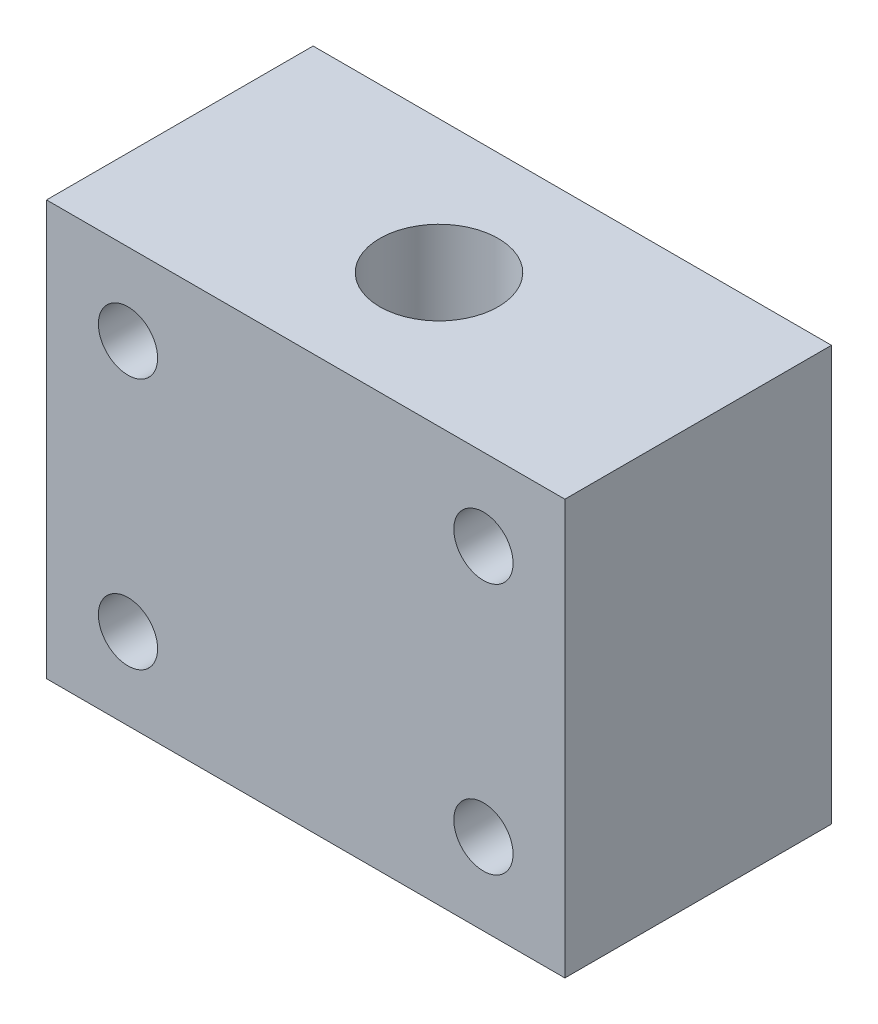
ISO-10303-21;
HEADER;
FILE_DESCRIPTION(('STEP AP214'),'2;1');
FILE_NAME('part.step','',(''),(''),'','','');
FILE_SCHEMA(('AUTOMOTIVE_DESIGN { 1 0 10303 214 1 1 1 1 }'));
ENDSEC;
DATA;
#1=APPLICATION_CONTEXT('core data for automotive mechanical design processes');
#2=APPLICATION_PROTOCOL_DEFINITION('international standard','automotive_design',2000,#1);
#3=PRODUCT_CONTEXT('',#1,'mechanical');
#4=PRODUCT('Part','Part','',(#3));
#5=PRODUCT_RELATED_PRODUCT_CATEGORY('part','',(#4));
#6=PRODUCT_DEFINITION_FORMATION('','',#4);
#7=PRODUCT_DEFINITION_CONTEXT('part definition',#1,'design');
#8=PRODUCT_DEFINITION('design','',#6,#7);
#9=PRODUCT_DEFINITION_SHAPE('','',#8);
#10=(LENGTH_UNIT() NAMED_UNIT(*) SI_UNIT(.MILLI.,.METRE.));
#11=(NAMED_UNIT(*) PLANE_ANGLE_UNIT() SI_UNIT($,.RADIAN.));
#12=(NAMED_UNIT(*) SI_UNIT($,.STERADIAN.) SOLID_ANGLE_UNIT());
#13=UNCERTAINTY_MEASURE_WITH_UNIT(LENGTH_MEASURE(1.E-05),#10,'distance_accuracy_value','');
#14=(GEOMETRIC_REPRESENTATION_CONTEXT(3) GLOBAL_UNCERTAINTY_ASSIGNED_CONTEXT((#13)) GLOBAL_UNIT_ASSIGNED_CONTEXT((#10,
#11,#12)) REPRESENTATION_CONTEXT('',''));
#15=CARTESIAN_POINT('',(0.,0.,0.));
#16=DIRECTION('',(0.,0.,1.));
#17=DIRECTION('',(1.,0.,0.));
#18=AXIS2_PLACEMENT_3D('',#15,#16,#17);
#19=CARTESIAN_POINT('',(0.,0.,18.));
#20=DIRECTION('',(0.,0.,-1.));
#21=DIRECTION('',(-1.,0.,0.));
#22=AXIS2_PLACEMENT_3D('',#19,#20,#21);
#23=PLANE('',#22);
#24=DIRECTION('',(0.,-1.,0.));
#25=VECTOR('',#24,1.);
#26=CARTESIAN_POINT('',(-31.0409039529371,-8.22103591548125,18.));
#27=LINE('',#26,#25);
#28=CARTESIAN_POINT('',(-31.0409039529371,19.7789640845187,18.));
#29=VERTEX_POINT('',#28);
#30=CARTESIAN_POINT('',(-31.0409039529371,-8.22103591548125,18.));
#31=VERTEX_POINT('',#30);
#32=EDGE_CURVE('E84',#29,#31,#27,.T.);
#33=ORIENTED_EDGE('',*,*,#32,.T.);
#34=DIRECTION('',(1.,0.,0.));
#35=VECTOR('',#34,1.);
#36=CARTESIAN_POINT('',(-31.0409039529371,-8.22103591548125,18.));
#37=LINE('',#36,#35);
#38=CARTESIAN_POINT('',(3.95909604706289,-8.22103591548125,18.));
#39=VERTEX_POINT('',#38);
#40=EDGE_CURVE('E79',#31,#39,#37,.T.);
#41=ORIENTED_EDGE('',*,*,#40,.T.);
#42=DIRECTION('',(0.,1.,0.));
#43=VECTOR('',#42,1.);
#44=CARTESIAN_POINT('',(3.95909604706289,-8.22103591548125,18.));
#45=LINE('',#44,#43);
#46=CARTESIAN_POINT('',(3.95909604706289,19.7789640845187,18.));
#47=VERTEX_POINT('',#46);
#48=EDGE_CURVE('E82',#39,#47,#45,.T.);
#49=ORIENTED_EDGE('',*,*,#48,.T.);
#50=DIRECTION('',(-1.,0.,0.));
#51=VECTOR('',#50,1.);
#52=CARTESIAN_POINT('',(-31.0409039529371,19.7789640845187,18.));
#53=LINE('',#52,#51);
#54=EDGE_CURVE('E49',#47,#29,#53,.T.);
#55=ORIENTED_EDGE('',*,*,#54,.T.);
#56=EDGE_LOOP('',(#33,#41,#49,#55));
#57=FACE_BOUND('',#56,.T.);
#58=CARTESIAN_POINT('',(-25.5409039529371,14.2789640845187,18.));
#59=DIRECTION('',(0.,0.,1.));
#60=DIRECTION('',(1.,0.,0.));
#61=AXIS2_PLACEMENT_3D('',#58,#59,#60);
#62=CIRCLE('',#61,2.);
#63=CARTESIAN_POINT('',(-23.5409039529371,14.2789640845187,18.));
#64=VERTEX_POINT('',#63);
#65=EDGE_CURVE('E99',#64,#64,#62,.T.);
#66=ORIENTED_EDGE('',*,*,#65,.F.);
#67=EDGE_LOOP('',(#66));
#68=FACE_BOUND('',#67,.T.);
#69=CARTESIAN_POINT('',(-1.54090395293711,14.2789640845187,18.));
#70=DIRECTION('',(0.,0.,1.));
#71=DIRECTION('',(1.,0.,0.));
#72=AXIS2_PLACEMENT_3D('',#69,#70,#71);
#73=CIRCLE('',#72,2.);
#74=CARTESIAN_POINT('',(0.459096047062897,14.2789640845187,18.));
#75=VERTEX_POINT('',#74);
#76=EDGE_CURVE('E114',#75,#75,#73,.T.);
#77=ORIENTED_EDGE('',*,*,#76,.F.);
#78=EDGE_LOOP('',(#77));
#79=FACE_BOUND('',#78,.T.);
#80=CARTESIAN_POINT('',(-25.5409039529371,-2.72103591548126,18.));
#81=DIRECTION('',(0.,0.,1.));
#82=DIRECTION('',(1.,0.,0.));
#83=AXIS2_PLACEMENT_3D('',#80,#81,#82);
#84=CIRCLE('',#83,2.);
#85=CARTESIAN_POINT('',(-23.5409039529371,-2.72103591548126,18.));
#86=VERTEX_POINT('',#85);
#87=EDGE_CURVE('E120',#86,#86,#84,.T.);
#88=ORIENTED_EDGE('',*,*,#87,.F.);
#89=EDGE_LOOP('',(#88));
#90=FACE_BOUND('',#89,.T.);
#91=CARTESIAN_POINT('',(-1.54090395293711,-2.72103591548126,18.));
#92=DIRECTION('',(0.,0.,1.));
#93=DIRECTION('',(1.,0.,0.));
#94=AXIS2_PLACEMENT_3D('',#91,#92,#93);
#95=CIRCLE('',#94,2.);
#96=CARTESIAN_POINT('',(0.459096047062896,-2.72103591548126,18.));
#97=VERTEX_POINT('',#96);
#98=EDGE_CURVE('E126',#97,#97,#95,.T.);
#99=ORIENTED_EDGE('',*,*,#98,.F.);
#100=EDGE_LOOP('',(#99));
#101=FACE_BOUND('',#100,.T.);
#102=ADVANCED_FACE('F32',(#57,#68,#79,#90,#101),#23,.F.);
#103=CARTESIAN_POINT('',(0.,0.,0.));
#104=DIRECTION('',(0.,0.,-1.));
#105=DIRECTION('',(-1.,0.,0.));
#106=AXIS2_PLACEMENT_3D('',#103,#104,#105);
#107=PLANE('',#106);
#108=CARTESIAN_POINT('',(-25.5409039529371,-2.72103591548126,0.));
#109=DIRECTION('',(0.,0.,1.));
#110=DIRECTION('',(1.,0.,0.));
#111=AXIS2_PLACEMENT_3D('',#108,#109,#110);
#112=CIRCLE('',#111,2.);
#113=CARTESIAN_POINT('',(-23.5409039529371,-2.72103591548126,0.));
#114=VERTEX_POINT('',#113);
#115=EDGE_CURVE('E123',#114,#114,#112,.T.);
#116=ORIENTED_EDGE('',*,*,#115,.T.);
#117=EDGE_LOOP('',(#116));
#118=FACE_BOUND('',#117,.T.);
#119=CARTESIAN_POINT('',(-25.5409039529371,14.2789640845187,0.));
#120=DIRECTION('',(0.,0.,1.));
#121=DIRECTION('',(1.,0.,0.));
#122=AXIS2_PLACEMENT_3D('',#119,#120,#121);
#123=CIRCLE('',#122,2.);
#124=CARTESIAN_POINT('',(-23.5409039529371,14.2789640845187,0.));
#125=VERTEX_POINT('',#124);
#126=EDGE_CURVE('E111',#125,#125,#123,.T.);
#127=ORIENTED_EDGE('',*,*,#126,.T.);
#128=EDGE_LOOP('',(#127));
#129=FACE_BOUND('',#128,.T.);
#130=DIRECTION('',(0.,-1.,0.));
#131=VECTOR('',#130,1.);
#132=CARTESIAN_POINT('',(-31.0409039529371,-8.22103591548125,0.));
#133=LINE('',#132,#131);
#134=CARTESIAN_POINT('',(-31.0409039529371,19.7789640845187,0.));
#135=VERTEX_POINT('',#134);
#136=CARTESIAN_POINT('',(-31.0409039529371,-8.22103591548125,0.));
#137=VERTEX_POINT('',#136);
#138=EDGE_CURVE('E96',#135,#137,#133,.T.);
#139=ORIENTED_EDGE('',*,*,#138,.F.);
#140=DIRECTION('',(-1.,0.,0.));
#141=VECTOR('',#140,1.);
#142=CARTESIAN_POINT('',(-31.0409039529371,19.7789640845187,0.));
#143=LINE('',#142,#141);
#144=CARTESIAN_POINT('',(3.95909604706289,19.7789640845187,0.));
#145=VERTEX_POINT('',#144);
#146=EDGE_CURVE('E72',#145,#135,#143,.T.);
#147=ORIENTED_EDGE('',*,*,#146,.F.);
#148=DIRECTION('',(0.,1.,0.));
#149=VECTOR('',#148,1.);
#150=CARTESIAN_POINT('',(3.95909604706289,-8.22103591548125,0.));
#151=LINE('',#150,#149);
#152=CARTESIAN_POINT('',(3.95909604706289,-8.22103591548125,0.));
#153=VERTEX_POINT('',#152);
#154=EDGE_CURVE('E66',#153,#145,#151,.T.);
#155=ORIENTED_EDGE('',*,*,#154,.F.);
#156=DIRECTION('',(1.,0.,0.));
#157=VECTOR('',#156,1.);
#158=CARTESIAN_POINT('',(-31.0409039529371,-8.22103591548125,0.));
#159=LINE('',#158,#157);
#160=EDGE_CURVE('E88',#137,#153,#159,.T.);
#161=ORIENTED_EDGE('',*,*,#160,.F.);
#162=EDGE_LOOP('',(#139,#147,#155,#161));
#163=FACE_BOUND('',#162,.T.);
#164=CARTESIAN_POINT('',(-1.54090395293711,14.2789640845187,0.));
#165=DIRECTION('',(0.,0.,1.));
#166=DIRECTION('',(1.,0.,0.));
#167=AXIS2_PLACEMENT_3D('',#164,#165,#166);
#168=CIRCLE('',#167,2.);
#169=CARTESIAN_POINT('',(0.459096047062897,14.2789640845187,0.));
#170=VERTEX_POINT('',#169);
#171=EDGE_CURVE('E117',#170,#170,#168,.T.);
#172=ORIENTED_EDGE('',*,*,#171,.T.);
#173=EDGE_LOOP('',(#172));
#174=FACE_BOUND('',#173,.T.);
#175=CARTESIAN_POINT('',(-1.54090395293711,-2.72103591548126,0.));
#176=DIRECTION('',(0.,0.,1.));
#177=DIRECTION('',(1.,0.,0.));
#178=AXIS2_PLACEMENT_3D('',#175,#176,#177);
#179=CIRCLE('',#178,2.);
#180=CARTESIAN_POINT('',(0.459096047062896,-2.72103591548126,0.));
#181=VERTEX_POINT('',#180);
#182=EDGE_CURVE('E129',#181,#181,#179,.T.);
#183=ORIENTED_EDGE('',*,*,#182,.T.);
#184=EDGE_LOOP('',(#183));
#185=FACE_BOUND('',#184,.T.);
#186=ADVANCED_FACE('F107',(#118,#129,#163,#174,#185),#107,.T.);
#187=CARTESIAN_POINT('',(-31.0409039529371,-8.22103591548125,18.));
#188=DIRECTION('',(1.,0.,0.));
#189=DIRECTION('',(0.,0.,-1.));
#190=AXIS2_PLACEMENT_3D('',#187,#188,#189);
#191=PLANE('',#190);
#192=ORIENTED_EDGE('',*,*,#138,.T.);
#193=DIRECTION('',(0.,0.,-1.));
#194=VECTOR('',#193,1.);
#195=CARTESIAN_POINT('',(-31.0409039529371,-8.22103591548125,18.));
#196=LINE('',#195,#194);
#197=EDGE_CURVE('E11',#31,#137,#196,.T.);
#198=ORIENTED_EDGE('',*,*,#197,.F.);
#199=ORIENTED_EDGE('',*,*,#32,.F.);
#200=DIRECTION('',(0.,0.,-1.));
#201=VECTOR('',#200,1.);
#202=CARTESIAN_POINT('',(-31.0409039529371,19.7789640845187,18.));
#203=LINE('',#202,#201);
#204=EDGE_CURVE('E92',#29,#135,#203,.T.);
#205=ORIENTED_EDGE('',*,*,#204,.T.);
#206=EDGE_LOOP('',(#192,#198,#199,#205));
#207=FACE_BOUND('',#206,.T.);
#208=ADVANCED_FACE('F34',(#207),#191,.F.);
#209=CARTESIAN_POINT('',(-31.0409039529371,-8.22103591548125,18.));
#210=DIRECTION('',(0.,1.,0.));
#211=DIRECTION('',(0.,0.,1.));
#212=AXIS2_PLACEMENT_3D('',#209,#210,#211);
#213=PLANE('',#212);
#214=CARTESIAN_POINT('',(-13.5409039529371,-8.22103591548125,9.));
#215=DIRECTION('',(0.,1.,0.));
#216=DIRECTION('',(0.,0.,1.));
#217=AXIS2_PLACEMENT_3D('',#214,#215,#216);
#218=CIRCLE('',#217,4.);
#219=CARTESIAN_POINT('',(-13.5409039529371,-8.22103591548125,13.));
#220=VERTEX_POINT('',#219);
#221=EDGE_CURVE('E135',#220,#220,#218,.T.);
#222=ORIENTED_EDGE('',*,*,#221,.T.);
#223=EDGE_LOOP('',(#222));
#224=FACE_BOUND('',#223,.T.);
#225=ORIENTED_EDGE('',*,*,#160,.T.);
#226=DIRECTION('',(0.,0.,-1.));
#227=VECTOR('',#226,1.);
#228=CARTESIAN_POINT('',(3.95909604706289,-8.22103591548125,18.));
#229=LINE('',#228,#227);
#230=EDGE_CURVE('E41',#39,#153,#229,.T.);
#231=ORIENTED_EDGE('',*,*,#230,.F.);
#232=ORIENTED_EDGE('',*,*,#40,.F.);
#233=ORIENTED_EDGE('',*,*,#197,.T.);
#234=EDGE_LOOP('',(#225,#231,#232,#233));
#235=FACE_BOUND('',#234,.T.);
#236=ADVANCED_FACE('F87',(#224,#235),#213,.F.);
#237=CARTESIAN_POINT('',(3.95909604706289,-8.22103591548125,18.));
#238=DIRECTION('',(-1.,0.,0.));
#239=DIRECTION('',(0.,0.,1.));
#240=AXIS2_PLACEMENT_3D('',#237,#238,#239);
#241=PLANE('',#240);
#242=ORIENTED_EDGE('',*,*,#154,.T.);
#243=DIRECTION('',(0.,0.,-1.));
#244=VECTOR('',#243,1.);
#245=CARTESIAN_POINT('',(3.95909604706289,19.7789640845187,18.));
#246=LINE('',#245,#244);
#247=EDGE_CURVE('E89',#47,#145,#246,.T.);
#248=ORIENTED_EDGE('',*,*,#247,.F.);
#249=ORIENTED_EDGE('',*,*,#48,.F.);
#250=ORIENTED_EDGE('',*,*,#230,.T.);
#251=EDGE_LOOP('',(#242,#248,#249,#250));
#252=FACE_BOUND('',#251,.T.);
#253=ADVANCED_FACE('F90',(#252),#241,.F.);
#254=CARTESIAN_POINT('',(-31.0409039529371,19.7789640845187,18.));
#255=DIRECTION('',(0.,-1.,0.));
#256=DIRECTION('',(0.,0.,-1.));
#257=AXIS2_PLACEMENT_3D('',#254,#255,#256);
#258=PLANE('',#257);
#259=CARTESIAN_POINT('',(-13.5409039529371,19.7789640845187,9.));
#260=DIRECTION('',(0.,1.,0.));
#261=DIRECTION('',(0.,0.,1.));
#262=AXIS2_PLACEMENT_3D('',#259,#260,#261);
#263=CIRCLE('',#262,4.);
#264=CARTESIAN_POINT('',(-13.5409039529371,19.7789640845187,13.));
#265=VERTEX_POINT('',#264);
#266=EDGE_CURVE('E132',#265,#265,#263,.T.);
#267=ORIENTED_EDGE('',*,*,#266,.F.);
#268=EDGE_LOOP('',(#267));
#269=FACE_BOUND('',#268,.T.);
#270=ORIENTED_EDGE('',*,*,#146,.T.);
#271=ORIENTED_EDGE('',*,*,#204,.F.);
#272=ORIENTED_EDGE('',*,*,#54,.F.);
#273=ORIENTED_EDGE('',*,*,#247,.T.);
#274=EDGE_LOOP('',(#270,#271,#272,#273));
#275=FACE_BOUND('',#274,.T.);
#276=ADVANCED_FACE('F104',(#269,#275),#258,.F.);
#277=CARTESIAN_POINT('',(-25.5409039529371,14.2789640845187,18.));
#278=DIRECTION('',(0.,0.,-1.));
#279=DIRECTION('',(-1.,0.,0.));
#280=AXIS2_PLACEMENT_3D('',#277,#278,#279);
#281=CYLINDRICAL_SURFACE('',#280,2.);
#282=ORIENTED_EDGE('',*,*,#65,.T.);
#283=EDGE_LOOP('',(#282));
#284=FACE_BOUND('',#283,.T.);
#285=ORIENTED_EDGE('',*,*,#126,.F.);
#286=EDGE_LOOP('',(#285));
#287=FACE_BOUND('',#286,.T.);
#288=ADVANCED_FACE('F145',(#284,#287),#281,.F.);
#289=CARTESIAN_POINT('',(-1.54090395293711,14.2789640845187,18.));
#290=DIRECTION('',(0.,0.,-1.));
#291=DIRECTION('',(-1.,0.,0.));
#292=AXIS2_PLACEMENT_3D('',#289,#290,#291);
#293=CYLINDRICAL_SURFACE('',#292,2.);
#294=ORIENTED_EDGE('',*,*,#76,.T.);
#295=EDGE_LOOP('',(#294));
#296=FACE_BOUND('',#295,.T.);
#297=ORIENTED_EDGE('',*,*,#171,.F.);
#298=EDGE_LOOP('',(#297));
#299=FACE_BOUND('',#298,.T.);
#300=ADVANCED_FACE('F151',(#296,#299),#293,.F.);
#301=CARTESIAN_POINT('',(-25.5409039529371,-2.72103591548126,18.));
#302=DIRECTION('',(0.,0.,-1.));
#303=DIRECTION('',(-1.,0.,0.));
#304=AXIS2_PLACEMENT_3D('',#301,#302,#303);
#305=CYLINDRICAL_SURFACE('',#304,2.);
#306=ORIENTED_EDGE('',*,*,#87,.T.);
#307=EDGE_LOOP('',(#306));
#308=FACE_BOUND('',#307,.T.);
#309=ORIENTED_EDGE('',*,*,#115,.F.);
#310=EDGE_LOOP('',(#309));
#311=FACE_BOUND('',#310,.T.);
#312=ADVANCED_FACE('F165',(#308,#311),#305,.F.);
#313=CARTESIAN_POINT('',(-1.54090395293711,-2.72103591548126,18.));
#314=DIRECTION('',(0.,0.,-1.));
#315=DIRECTION('',(-1.,0.,0.));
#316=AXIS2_PLACEMENT_3D('',#313,#314,#315);
#317=CYLINDRICAL_SURFACE('',#316,2.);
#318=ORIENTED_EDGE('',*,*,#98,.T.);
#319=EDGE_LOOP('',(#318));
#320=FACE_BOUND('',#319,.T.);
#321=ORIENTED_EDGE('',*,*,#182,.F.);
#322=EDGE_LOOP('',(#321));
#323=FACE_BOUND('',#322,.T.);
#324=ADVANCED_FACE('F169',(#320,#323),#317,.F.);
#325=CARTESIAN_POINT('',(-13.5409039529371,19.7789640845187,9.));
#326=DIRECTION('',(0.,-1.,0.));
#327=DIRECTION('',(0.,0.,-1.));
#328=AXIS2_PLACEMENT_3D('',#325,#326,#327);
#329=CYLINDRICAL_SURFACE('',#328,4.);
#330=ORIENTED_EDGE('',*,*,#266,.T.);
#331=EDGE_LOOP('',(#330));
#332=FACE_BOUND('',#331,.T.);
#333=ORIENTED_EDGE('',*,*,#221,.F.);
#334=EDGE_LOOP('',(#333));
#335=FACE_BOUND('',#334,.T.);
#336=ADVANCED_FACE('F141',(#332,#335),#329,.F.);
#337=CLOSED_SHELL('',(#102,#186,#208,#236,#253,#276,#288,#300,#312,#324,#336));
#338=MANIFOLD_SOLID_BREP('B2',#337);
#339=ADVANCED_BREP_SHAPE_REPRESENTATION('',(#18,#338),#14);
#340=SHAPE_DEFINITION_REPRESENTATION(#9,#339);
ENDSEC;
END-ISO-10303-21;
